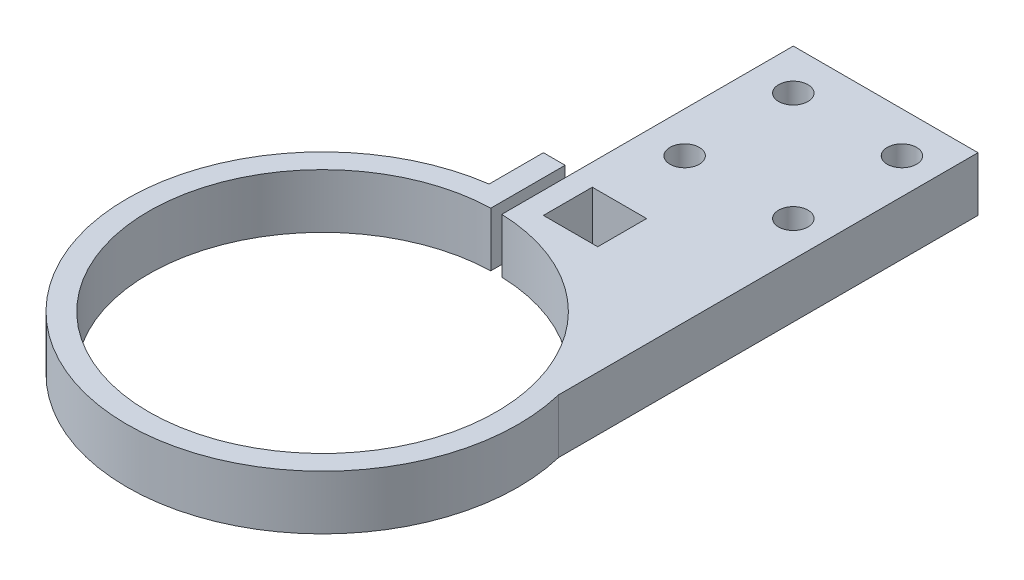
ISO-10303-21;
HEADER;
FILE_DESCRIPTION(('STEP AP214'),'2;1');
FILE_NAME('part.step','',(''),(''),'','','');
FILE_SCHEMA(('AUTOMOTIVE_DESIGN { 1 0 10303 214 1 1 1 1 }'));
ENDSEC;
DATA;
#1=APPLICATION_CONTEXT('core data for automotive mechanical design processes');
#2=APPLICATION_PROTOCOL_DEFINITION('international standard','automotive_design',2000,#1);
#3=PRODUCT_CONTEXT('',#1,'mechanical');
#4=PRODUCT('Part','Part','',(#3));
#5=PRODUCT_RELATED_PRODUCT_CATEGORY('part','',(#4));
#6=PRODUCT_DEFINITION_FORMATION('','',#4);
#7=PRODUCT_DEFINITION_CONTEXT('part definition',#1,'design');
#8=PRODUCT_DEFINITION('design','',#6,#7);
#9=PRODUCT_DEFINITION_SHAPE('','',#8);
#10=(LENGTH_UNIT() NAMED_UNIT(*) SI_UNIT(.MILLI.,.METRE.));
#11=(NAMED_UNIT(*) PLANE_ANGLE_UNIT() SI_UNIT($,.RADIAN.));
#12=(NAMED_UNIT(*) SI_UNIT($,.STERADIAN.) SOLID_ANGLE_UNIT());
#13=UNCERTAINTY_MEASURE_WITH_UNIT(LENGTH_MEASURE(1.E-05),#10,'distance_accuracy_value','');
#14=(GEOMETRIC_REPRESENTATION_CONTEXT(3) GLOBAL_UNCERTAINTY_ASSIGNED_CONTEXT((#13)) GLOBAL_UNIT_ASSIGNED_CONTEXT((#10,
#11,#12)) REPRESENTATION_CONTEXT('',''));
#15=CARTESIAN_POINT('',(0.,0.,0.));
#16=DIRECTION('',(0.,0.,1.));
#17=DIRECTION('',(1.,0.,0.));
#18=AXIS2_PLACEMENT_3D('',#15,#16,#17);
#19=CARTESIAN_POINT('',(0.,12.7,0.));
#20=DIRECTION('',(0.,-1.,0.));
#21=DIRECTION('',(0.,0.,-1.));
#22=AXIS2_PLACEMENT_3D('',#19,#20,#21);
#23=CYLINDRICAL_SURFACE('',#22,45.72);
#24=DIRECTION('',(0.,-1.,0.));
#25=VECTOR('',#24,1.);
#26=CARTESIAN_POINT('',(44.45,12.7,-10.701210211934));
#27=LINE('',#26,#25);
#28=CARTESIAN_POINT('',(44.45,0.,-10.701210211934));
#29=VERTEX_POINT('',#28);
#30=CARTESIAN_POINT('',(44.45,12.7,-10.701210211934));
#31=VERTEX_POINT('',#30);
#32=EDGE_CURVE('E231',#29,#31,#27,.F.);
#33=ORIENTED_EDGE('',*,*,#32,.T.);
#34=CARTESIAN_POINT('',(0.,12.7,0.));
#35=DIRECTION('',(0.,1.,0.));
#36=DIRECTION('',(0.,0.,1.));
#37=AXIS2_PLACEMENT_3D('',#34,#35,#36);
#38=CIRCLE('',#37,45.72);
#39=CARTESIAN_POINT('',(-6.34999999999999,12.7,-45.2768804137388));
#40=VERTEX_POINT('',#39);
#41=EDGE_CURVE('E45',#40,#31,#38,.T.);
#42=ORIENTED_EDGE('',*,*,#41,.F.);
#43=DIRECTION('',(0.,-1.,0.));
#44=VECTOR('',#43,1.);
#45=CARTESIAN_POINT('',(-6.35,12.7,-45.2768804137388));
#46=LINE('',#45,#44);
#47=CARTESIAN_POINT('',(-6.35,0.,-45.2768804137388));
#48=VERTEX_POINT('',#47);
#49=EDGE_CURVE('E322',#40,#48,#46,.T.);
#50=ORIENTED_EDGE('',*,*,#49,.T.);
#51=CARTESIAN_POINT('',(0.,0.,0.));
#52=DIRECTION('',(0.,1.,0.));
#53=DIRECTION('',(0.,0.,1.));
#54=AXIS2_PLACEMENT_3D('',#51,#52,#53);
#55=CIRCLE('',#54,45.72);
#56=EDGE_CURVE('E235',#48,#29,#55,.T.);
#57=ORIENTED_EDGE('',*,*,#56,.T.);
#58=EDGE_LOOP('',(#33,#42,#50,#57));
#59=FACE_BOUND('',#58,.T.);
#60=ADVANCED_FACE('F38',(#59),#23,.T.);
#61=CARTESIAN_POINT('',(0.,12.7,0.));
#62=DIRECTION('',(0.,1.,0.));
#63=DIRECTION('',(0.,0.,1.));
#64=AXIS2_PLACEMENT_3D('',#61,#62,#63);
#65=PLANE('',#64);
#66=DIRECTION('',(1.,0.,0.));
#67=VECTOR('',#66,1.);
#68=CARTESIAN_POINT('',(6.35,12.7,-45.2768804137388));
#69=LINE('',#68,#67);
#70=CARTESIAN_POINT('',(6.35,12.7,-45.2768804137388));
#71=VERTEX_POINT('',#70);
#72=CARTESIAN_POINT('',(19.05,12.7,-45.2768804137388));
#73=VERTEX_POINT('',#72);
#74=EDGE_CURVE('E134',#71,#73,#69,.T.);
#75=ORIENTED_EDGE('',*,*,#74,.F.);
#76=DIRECTION('',(0.,0.,1.));
#77=VECTOR('',#76,1.);
#78=CARTESIAN_POINT('',(6.35,12.7,-56.7068804137388));
#79=LINE('',#78,#77);
#80=CARTESIAN_POINT('',(6.35,12.7,-56.7068804137388));
#81=VERTEX_POINT('',#80);
#82=EDGE_CURVE('E125',#81,#71,#79,.T.);
#83=ORIENTED_EDGE('',*,*,#82,.F.);
#84=DIRECTION('',(-1.,0.,0.));
#85=VECTOR('',#84,1.);
#86=CARTESIAN_POINT('',(6.35,12.7,-56.7068804137388));
#87=LINE('',#86,#85);
#88=CARTESIAN_POINT('',(19.05,12.7,-56.7068804137388));
#89=VERTEX_POINT('',#88);
#90=EDGE_CURVE('E152',#89,#81,#87,.T.);
#91=ORIENTED_EDGE('',*,*,#90,.F.);
#92=DIRECTION('',(0.,0.,-1.));
#93=VECTOR('',#92,1.);
#94=CARTESIAN_POINT('',(19.05,12.7,-56.7068804137388));
#95=LINE('',#94,#93);
#96=EDGE_CURVE('E148',#73,#89,#95,.T.);
#97=ORIENTED_EDGE('',*,*,#96,.F.);
#98=EDGE_LOOP('',(#75,#83,#91,#97));
#99=FACE_BOUND('',#98,.T.);
#100=CARTESIAN_POINT('',(36.195,12.7,-99.2518804137387));
#101=DIRECTION('',(0.,1.,0.));
#102=DIRECTION('',(0.,0.,1.));
#103=AXIS2_PLACEMENT_3D('',#100,#101,#102);
#104=CIRCLE('',#103,3.42900000000001);
#105=CARTESIAN_POINT('',(36.195,12.7,-95.8228804137387));
#106=VERTEX_POINT('',#105);
#107=EDGE_CURVE('E168',#106,#106,#104,.T.);
#108=ORIENTED_EDGE('',*,*,#107,.F.);
#109=EDGE_LOOP('',(#108));
#110=FACE_BOUND('',#109,.T.);
#111=CARTESIAN_POINT('',(36.1950000000003,12.7,-73.8518804137388));
#112=DIRECTION('',(0.,1.,0.));
#113=DIRECTION('',(0.,0.,1.));
#114=AXIS2_PLACEMENT_3D('',#111,#112,#113);
#115=CIRCLE('',#114,3.42900000000001);
#116=CARTESIAN_POINT('',(36.1950000000003,12.7,-70.4228804137388));
#117=VERTEX_POINT('',#116);
#118=EDGE_CURVE('E189',#117,#117,#115,.T.);
#119=ORIENTED_EDGE('',*,*,#118,.F.);
#120=EDGE_LOOP('',(#119));
#121=FACE_BOUND('',#120,.T.);
#122=CARTESIAN_POINT('',(10.7950000000003,12.7,-73.8518804137388));
#123=DIRECTION('',(0.,1.,0.));
#124=DIRECTION('',(0.,0.,1.));
#125=AXIS2_PLACEMENT_3D('',#122,#123,#124);
#126=CIRCLE('',#125,3.42900000000001);
#127=CARTESIAN_POINT('',(10.7950000000003,12.7,-70.4228804137387));
#128=VERTEX_POINT('',#127);
#129=EDGE_CURVE('E196',#128,#128,#126,.T.);
#130=ORIENTED_EDGE('',*,*,#129,.F.);
#131=EDGE_LOOP('',(#130));
#132=FACE_BOUND('',#131,.T.);
#133=CARTESIAN_POINT('',(10.795,12.7,-99.2518804137387));
#134=DIRECTION('',(0.,1.,0.));
#135=DIRECTION('',(0.,0.,1.));
#136=AXIS2_PLACEMENT_3D('',#133,#134,#135);
#137=CIRCLE('',#136,3.42900000000001);
#138=CARTESIAN_POINT('',(10.795,12.7,-95.8228804137387));
#139=VERTEX_POINT('',#138);
#140=EDGE_CURVE('E274',#139,#139,#137,.T.);
#141=ORIENTED_EDGE('',*,*,#140,.F.);
#142=EDGE_LOOP('',(#141));
#143=FACE_BOUND('',#142,.T.);
#144=ORIENTED_EDGE('',*,*,#41,.T.);
#145=DIRECTION('',(0.,0.,1.));
#146=VECTOR('',#145,1.);
#147=CARTESIAN_POINT('',(44.45,12.7,-57.9768804137388));
#148=LINE('',#147,#146);
#149=CARTESIAN_POINT('',(44.45,12.7,-108.776880413739));
#150=VERTEX_POINT('',#149);
#151=EDGE_CURVE('E239',#150,#31,#148,.T.);
#152=ORIENTED_EDGE('',*,*,#151,.F.);
#153=DIRECTION('',(-1.,0.,0.));
#154=VECTOR('',#153,1.);
#155=CARTESIAN_POINT('',(44.45,12.7,-108.776880413739));
#156=LINE('',#155,#154);
#157=CARTESIAN_POINT('',(1.27,12.7,-108.776880413739));
#158=VERTEX_POINT('',#157);
#159=EDGE_CURVE('E269',#150,#158,#156,.T.);
#160=ORIENTED_EDGE('',*,*,#159,.T.);
#161=DIRECTION('',(0.,0.,-1.));
#162=VECTOR('',#161,1.);
#163=CARTESIAN_POINT('',(1.27,12.7,-39.7899336263232));
#164=LINE('',#163,#162);
#165=CARTESIAN_POINT('',(1.27,12.7,-40.6201514029675));
#166=VERTEX_POINT('',#165);
#167=EDGE_CURVE('E292',#166,#158,#164,.T.);
#168=ORIENTED_EDGE('',*,*,#167,.F.);
#169=CARTESIAN_POINT('',(0.,12.7,0.));
#170=DIRECTION('',(0.,1.,0.));
#171=DIRECTION('',(0.,0.,1.));
#172=AXIS2_PLACEMENT_3D('',#169,#170,#171);
#173=CIRCLE('',#172,40.64);
#174=CARTESIAN_POINT('',(-1.27,12.7,-40.6201514029675));
#175=VERTEX_POINT('',#174);
#176=EDGE_CURVE('E323',#175,#166,#173,.T.);
#177=ORIENTED_EDGE('',*,*,#176,.F.);
#178=DIRECTION('',(0.,0.,1.));
#179=VECTOR('',#178,1.);
#180=CARTESIAN_POINT('',(-1.27,12.7,-39.7899336263232));
#181=LINE('',#180,#179);
#182=CARTESIAN_POINT('',(-1.27,12.7,-57.9768804137387));
#183=VERTEX_POINT('',#182);
#184=EDGE_CURVE('E297',#183,#175,#181,.T.);
#185=ORIENTED_EDGE('',*,*,#184,.F.);
#186=DIRECTION('',(-1.,0.,0.));
#187=VECTOR('',#186,1.);
#188=CARTESIAN_POINT('',(6.35,12.7,-57.9768804137387));
#189=LINE('',#188,#187);
#190=CARTESIAN_POINT('',(-6.35,12.7,-57.9768804137387));
#191=VERTEX_POINT('',#190);
#192=EDGE_CURVE('E308',#183,#191,#189,.T.);
#193=ORIENTED_EDGE('',*,*,#192,.T.);
#194=DIRECTION('',(0.,0.,1.));
#195=VECTOR('',#194,1.);
#196=CARTESIAN_POINT('',(-6.35,12.7,-57.9768804137387));
#197=LINE('',#196,#195);
#198=EDGE_CURVE('E246',#191,#40,#197,.T.);
#199=ORIENTED_EDGE('',*,*,#198,.T.);
#200=EDGE_LOOP('',(#144,#152,#160,#168,#177,#185,#193,#199));
#201=FACE_BOUND('',#200,.T.);
#202=ADVANCED_FACE('F146',(#99,#110,#121,#132,#143,#201),#65,.T.);
#203=CARTESIAN_POINT('',(0.,0.,0.));
#204=DIRECTION('',(0.,1.,0.));
#205=DIRECTION('',(0.,0.,1.));
#206=AXIS2_PLACEMENT_3D('',#203,#204,#205);
#207=PLANE('',#206);
#208=DIRECTION('',(0.,0.,1.));
#209=VECTOR('',#208,1.);
#210=CARTESIAN_POINT('',(6.35,0.,-56.7068804137388));
#211=LINE('',#210,#209);
#212=CARTESIAN_POINT('',(6.35,0.,-56.7068804137388));
#213=VERTEX_POINT('',#212);
#214=CARTESIAN_POINT('',(6.35,0.,-45.2768804137388));
#215=VERTEX_POINT('',#214);
#216=EDGE_CURVE('E60',#213,#215,#211,.T.);
#217=ORIENTED_EDGE('',*,*,#216,.T.);
#218=DIRECTION('',(1.,0.,0.));
#219=VECTOR('',#218,1.);
#220=CARTESIAN_POINT('',(6.35,0.,-45.2768804137388));
#221=LINE('',#220,#219);
#222=CARTESIAN_POINT('',(19.05,0.,-45.2768804137388));
#223=VERTEX_POINT('',#222);
#224=EDGE_CURVE('E141',#215,#223,#221,.T.);
#225=ORIENTED_EDGE('',*,*,#224,.T.);
#226=DIRECTION('',(0.,0.,-1.));
#227=VECTOR('',#226,1.);
#228=CARTESIAN_POINT('',(19.05,0.,-56.7068804137388));
#229=LINE('',#228,#227);
#230=CARTESIAN_POINT('',(19.05,0.,-56.7068804137388));
#231=VERTEX_POINT('',#230);
#232=EDGE_CURVE('E170',#223,#231,#229,.T.);
#233=ORIENTED_EDGE('',*,*,#232,.T.);
#234=DIRECTION('',(-1.,0.,0.));
#235=VECTOR('',#234,1.);
#236=CARTESIAN_POINT('',(6.35,0.,-56.7068804137388));
#237=LINE('',#236,#235);
#238=EDGE_CURVE('E135',#231,#213,#237,.T.);
#239=ORIENTED_EDGE('',*,*,#238,.T.);
#240=EDGE_LOOP('',(#217,#225,#233,#239));
#241=FACE_BOUND('',#240,.T.);
#242=CARTESIAN_POINT('',(36.195,0.,-99.2518804137387));
#243=DIRECTION('',(0.,1.,0.));
#244=DIRECTION('',(0.,0.,1.));
#245=AXIS2_PLACEMENT_3D('',#242,#243,#244);
#246=CIRCLE('',#245,3.42900000000001);
#247=CARTESIAN_POINT('',(36.195,0.,-95.8228804137387));
#248=VERTEX_POINT('',#247);
#249=EDGE_CURVE('E182',#248,#248,#246,.T.);
#250=ORIENTED_EDGE('',*,*,#249,.T.);
#251=EDGE_LOOP('',(#250));
#252=FACE_BOUND('',#251,.T.);
#253=CARTESIAN_POINT('',(36.1950000000003,0.,-73.8518804137388));
#254=DIRECTION('',(0.,1.,0.));
#255=DIRECTION('',(0.,0.,1.));
#256=AXIS2_PLACEMENT_3D('',#253,#254,#255);
#257=CIRCLE('',#256,3.42900000000001);
#258=CARTESIAN_POINT('',(36.1950000000003,0.,-70.4228804137388));
#259=VERTEX_POINT('',#258);
#260=EDGE_CURVE('E194',#259,#259,#257,.T.);
#261=ORIENTED_EDGE('',*,*,#260,.T.);
#262=EDGE_LOOP('',(#261));
#263=FACE_BOUND('',#262,.T.);
#264=CARTESIAN_POINT('',(10.7950000000003,0.,-73.8518804137388));
#265=DIRECTION('',(0.,1.,0.));
#266=DIRECTION('',(0.,0.,1.));
#267=AXIS2_PLACEMENT_3D('',#264,#265,#266);
#268=CIRCLE('',#267,3.42900000000001);
#269=CARTESIAN_POINT('',(10.7950000000003,0.,-70.4228804137387));
#270=VERTEX_POINT('',#269);
#271=EDGE_CURVE('E200',#270,#270,#268,.T.);
#272=ORIENTED_EDGE('',*,*,#271,.T.);
#273=EDGE_LOOP('',(#272));
#274=FACE_BOUND('',#273,.T.);
#275=CARTESIAN_POINT('',(10.795,0.,-99.2518804137387));
#276=DIRECTION('',(0.,1.,0.));
#277=DIRECTION('',(0.,0.,1.));
#278=AXIS2_PLACEMENT_3D('',#275,#276,#277);
#279=CIRCLE('',#278,3.42900000000001);
#280=CARTESIAN_POINT('',(10.795,0.,-95.8228804137387));
#281=VERTEX_POINT('',#280);
#282=EDGE_CURVE('E142',#281,#281,#279,.T.);
#283=ORIENTED_EDGE('',*,*,#282,.T.);
#284=EDGE_LOOP('',(#283));
#285=FACE_BOUND('',#284,.T.);
#286=DIRECTION('',(0.,0.,-1.));
#287=VECTOR('',#286,1.);
#288=CARTESIAN_POINT('',(1.27,0.,-39.7899336263232));
#289=LINE('',#288,#287);
#290=CARTESIAN_POINT('',(1.27,0.,-40.6201514029675));
#291=VERTEX_POINT('',#290);
#292=CARTESIAN_POINT('',(1.27,0.,-108.776880413739));
#293=VERTEX_POINT('',#292);
#294=EDGE_CURVE('E258',#291,#293,#289,.T.);
#295=ORIENTED_EDGE('',*,*,#294,.T.);
#296=DIRECTION('',(-1.,0.,0.));
#297=VECTOR('',#296,1.);
#298=CARTESIAN_POINT('',(44.45,0.,-108.776880413739));
#299=LINE('',#298,#297);
#300=CARTESIAN_POINT('',(44.45,0.,-108.776880413739));
#301=VERTEX_POINT('',#300);
#302=EDGE_CURVE('E273',#301,#293,#299,.T.);
#303=ORIENTED_EDGE('',*,*,#302,.F.);
#304=DIRECTION('',(0.,0.,-1.));
#305=VECTOR('',#304,1.);
#306=CARTESIAN_POINT('',(44.45,0.,-57.9768804137388));
#307=LINE('',#306,#305);
#308=EDGE_CURVE('E255',#29,#301,#307,.T.);
#309=ORIENTED_EDGE('',*,*,#308,.F.);
#310=ORIENTED_EDGE('',*,*,#56,.F.);
#311=DIRECTION('',(0.,0.,1.));
#312=VECTOR('',#311,1.);
#313=CARTESIAN_POINT('',(-6.35,0.,-57.9768804137387));
#314=LINE('',#313,#312);
#315=CARTESIAN_POINT('',(-6.35,0.,-57.9768804137387));
#316=VERTEX_POINT('',#315);
#317=EDGE_CURVE('E315',#316,#48,#314,.T.);
#318=ORIENTED_EDGE('',*,*,#317,.F.);
#319=DIRECTION('',(-1.,0.,0.));
#320=VECTOR('',#319,1.);
#321=CARTESIAN_POINT('',(6.35,0.,-57.9768804137387));
#322=LINE('',#321,#320);
#323=CARTESIAN_POINT('',(-1.27,0.,-57.9768804137387));
#324=VERTEX_POINT('',#323);
#325=EDGE_CURVE('E318',#324,#316,#322,.T.);
#326=ORIENTED_EDGE('',*,*,#325,.F.);
#327=DIRECTION('',(0.,0.,1.));
#328=VECTOR('',#327,1.);
#329=CARTESIAN_POINT('',(-1.27,0.,-39.7899336263232));
#330=LINE('',#329,#328);
#331=CARTESIAN_POINT('',(-1.27,0.,-40.6201514029675));
#332=VERTEX_POINT('',#331);
#333=EDGE_CURVE('E288',#324,#332,#330,.T.);
#334=ORIENTED_EDGE('',*,*,#333,.T.);
#335=CARTESIAN_POINT('',(0.,0.,0.));
#336=DIRECTION('',(0.,1.,0.));
#337=DIRECTION('',(0.,0.,1.));
#338=AXIS2_PLACEMENT_3D('',#335,#336,#337);
#339=CIRCLE('',#338,40.64);
#340=EDGE_CURVE('E285',#332,#291,#339,.T.);
#341=ORIENTED_EDGE('',*,*,#340,.T.);
#342=EDGE_LOOP('',(#295,#303,#309,#310,#318,#326,#334,#341));
#343=FACE_BOUND('',#342,.T.);
#344=ADVANCED_FACE('F204',(#241,#252,#263,#274,#285,#343),#207,.F.);
#345=CARTESIAN_POINT('',(0.,12.7,0.));
#346=DIRECTION('',(0.,-1.,0.));
#347=DIRECTION('',(0.,0.,-1.));
#348=AXIS2_PLACEMENT_3D('',#345,#346,#347);
#349=CYLINDRICAL_SURFACE('',#348,40.64);
#350=ORIENTED_EDGE('',*,*,#176,.T.);
#351=DIRECTION('',(0.,-1.,0.));
#352=VECTOR('',#351,1.);
#353=CARTESIAN_POINT('',(1.27,12.7,-40.6201514029675));
#354=LINE('',#353,#352);
#355=EDGE_CURVE('E293',#166,#291,#354,.T.);
#356=ORIENTED_EDGE('',*,*,#355,.T.);
#357=ORIENTED_EDGE('',*,*,#340,.F.);
#358=DIRECTION('',(0.,-1.,0.));
#359=VECTOR('',#358,1.);
#360=CARTESIAN_POINT('',(-1.27,12.7,-40.6201514029675));
#361=LINE('',#360,#359);
#362=EDGE_CURVE('E300',#332,#175,#361,.F.);
#363=ORIENTED_EDGE('',*,*,#362,.T.);
#364=EDGE_LOOP('',(#350,#356,#357,#363));
#365=FACE_BOUND('',#364,.T.);
#366=ADVANCED_FACE('F329',(#365),#349,.F.);
#367=CARTESIAN_POINT('',(6.35,12.7,-57.9768804137387));
#368=DIRECTION('',(0.,0.,1.));
#369=DIRECTION('',(1.,0.,0.));
#370=AXIS2_PLACEMENT_3D('',#367,#368,#369);
#371=PLANE('',#370);
#372=DIRECTION('',(0.,1.,0.));
#373=VECTOR('',#372,1.);
#374=CARTESIAN_POINT('',(-1.27,12.7,-57.9768804137387));
#375=LINE('',#374,#373);
#376=EDGE_CURVE('E12',#324,#183,#375,.T.);
#377=ORIENTED_EDGE('',*,*,#376,.F.);
#378=ORIENTED_EDGE('',*,*,#325,.T.);
#379=DIRECTION('',(0.,-1.,0.));
#380=VECTOR('',#379,1.);
#381=CARTESIAN_POINT('',(-6.35,12.7,-57.9768804137387));
#382=LINE('',#381,#380);
#383=EDGE_CURVE('E312',#191,#316,#382,.T.);
#384=ORIENTED_EDGE('',*,*,#383,.F.);
#385=ORIENTED_EDGE('',*,*,#192,.F.);
#386=EDGE_LOOP('',(#377,#378,#384,#385));
#387=FACE_BOUND('',#386,.T.);
#388=ADVANCED_FACE('F336',(#387),#371,.F.);
#389=CARTESIAN_POINT('',(-6.35,12.7,-57.9768804137387));
#390=DIRECTION('',(1.,0.,0.));
#391=DIRECTION('',(0.,0.,-1.));
#392=AXIS2_PLACEMENT_3D('',#389,#390,#391);
#393=PLANE('',#392);
#394=ORIENTED_EDGE('',*,*,#317,.T.);
#395=ORIENTED_EDGE('',*,*,#49,.F.);
#396=ORIENTED_EDGE('',*,*,#198,.F.);
#397=ORIENTED_EDGE('',*,*,#383,.T.);
#398=EDGE_LOOP('',(#394,#395,#396,#397));
#399=FACE_BOUND('',#398,.T.);
#400=ADVANCED_FACE('F340',(#399),#393,.F.);
#401=CARTESIAN_POINT('',(-1.27,12.7,-39.7899336263232));
#402=DIRECTION('',(1.,0.,0.));
#403=DIRECTION('',(0.,0.,-1.));
#404=AXIS2_PLACEMENT_3D('',#401,#402,#403);
#405=PLANE('',#404);
#406=ORIENTED_EDGE('',*,*,#333,.F.);
#407=ORIENTED_EDGE('',*,*,#376,.T.);
#408=ORIENTED_EDGE('',*,*,#184,.T.);
#409=ORIENTED_EDGE('',*,*,#362,.F.);
#410=EDGE_LOOP('',(#406,#407,#408,#409));
#411=FACE_BOUND('',#410,.T.);
#412=ADVANCED_FACE('F342',(#411),#405,.T.);
#413=CARTESIAN_POINT('',(1.27,12.7,-39.7899336263232));
#414=DIRECTION('',(-1.,0.,0.));
#415=DIRECTION('',(0.,0.,1.));
#416=AXIS2_PLACEMENT_3D('',#413,#414,#415);
#417=PLANE('',#416);
#418=ORIENTED_EDGE('',*,*,#167,.T.);
#419=DIRECTION('',(0.,1.,0.));
#420=VECTOR('',#419,1.);
#421=CARTESIAN_POINT('',(1.27,0.,-108.776880413739));
#422=LINE('',#421,#420);
#423=EDGE_CURVE('E240',#293,#158,#422,.T.);
#424=ORIENTED_EDGE('',*,*,#423,.F.);
#425=ORIENTED_EDGE('',*,*,#294,.F.);
#426=ORIENTED_EDGE('',*,*,#355,.F.);
#427=EDGE_LOOP('',(#418,#424,#425,#426));
#428=FACE_BOUND('',#427,.T.);
#429=ADVANCED_FACE('F290',(#428),#417,.T.);
#430=CARTESIAN_POINT('',(44.45,0.,0.));
#431=DIRECTION('',(-1.,0.,0.));
#432=DIRECTION('',(0.,0.,1.));
#433=AXIS2_PLACEMENT_3D('',#430,#431,#432);
#434=PLANE('',#433);
#435=ORIENTED_EDGE('',*,*,#32,.F.);
#436=ORIENTED_EDGE('',*,*,#308,.T.);
#437=DIRECTION('',(0.,1.,0.));
#438=VECTOR('',#437,1.);
#439=CARTESIAN_POINT('',(44.45,0.,-108.776880413739));
#440=LINE('',#439,#438);
#441=EDGE_CURVE('E252',#301,#150,#440,.T.);
#442=ORIENTED_EDGE('',*,*,#441,.T.);
#443=ORIENTED_EDGE('',*,*,#151,.T.);
#444=EDGE_LOOP('',(#435,#436,#442,#443));
#445=FACE_BOUND('',#444,.T.);
#446=ADVANCED_FACE('F250',(#445),#434,.F.);
#447=CARTESIAN_POINT('',(44.45,0.,-108.776880413739));
#448=DIRECTION('',(0.,0.,-1.));
#449=DIRECTION('',(-1.,0.,0.));
#450=AXIS2_PLACEMENT_3D('',#447,#448,#449);
#451=PLANE('',#450);
#452=ORIENTED_EDGE('',*,*,#159,.F.);
#453=ORIENTED_EDGE('',*,*,#441,.F.);
#454=ORIENTED_EDGE('',*,*,#302,.T.);
#455=ORIENTED_EDGE('',*,*,#423,.T.);
#456=EDGE_LOOP('',(#452,#453,#454,#455));
#457=FACE_BOUND('',#456,.T.);
#458=ADVANCED_FACE('F220',(#457),#451,.T.);
#459=CARTESIAN_POINT('',(10.795,12.7,-99.2518804137387));
#460=DIRECTION('',(0.,-1.,0.));
#461=DIRECTION('',(0.,0.,-1.));
#462=AXIS2_PLACEMENT_3D('',#459,#460,#461);
#463=CYLINDRICAL_SURFACE('',#462,3.42900000000001);
#464=ORIENTED_EDGE('',*,*,#140,.T.);
#465=EDGE_LOOP('',(#464));
#466=FACE_BOUND('',#465,.T.);
#467=ORIENTED_EDGE('',*,*,#282,.F.);
#468=EDGE_LOOP('',(#467));
#469=FACE_BOUND('',#468,.T.);
#470=ADVANCED_FACE('F210',(#466,#469),#463,.F.);
#471=CARTESIAN_POINT('',(10.7950000000003,12.7,-73.8518804137388));
#472=DIRECTION('',(0.,-1.,0.));
#473=DIRECTION('',(0.,0.,-1.));
#474=AXIS2_PLACEMENT_3D('',#471,#472,#473);
#475=CYLINDRICAL_SURFACE('',#474,3.42900000000001);
#476=ORIENTED_EDGE('',*,*,#129,.T.);
#477=EDGE_LOOP('',(#476));
#478=FACE_BOUND('',#477,.T.);
#479=ORIENTED_EDGE('',*,*,#271,.F.);
#480=EDGE_LOOP('',(#479));
#481=FACE_BOUND('',#480,.T.);
#482=ADVANCED_FACE('F207',(#478,#481),#475,.F.);
#483=CARTESIAN_POINT('',(36.1950000000003,12.7,-73.8518804137388));
#484=DIRECTION('',(0.,-1.,0.));
#485=DIRECTION('',(0.,0.,-1.));
#486=AXIS2_PLACEMENT_3D('',#483,#484,#485);
#487=CYLINDRICAL_SURFACE('',#486,3.42900000000001);
#488=ORIENTED_EDGE('',*,*,#118,.T.);
#489=EDGE_LOOP('',(#488));
#490=FACE_BOUND('',#489,.T.);
#491=ORIENTED_EDGE('',*,*,#260,.F.);
#492=EDGE_LOOP('',(#491));
#493=FACE_BOUND('',#492,.T.);
#494=ADVANCED_FACE('F209',(#490,#493),#487,.F.);
#495=CARTESIAN_POINT('',(36.195,12.7,-99.2518804137387));
#496=DIRECTION('',(0.,-1.,0.));
#497=DIRECTION('',(0.,0.,-1.));
#498=AXIS2_PLACEMENT_3D('',#495,#496,#497);
#499=CYLINDRICAL_SURFACE('',#498,3.42900000000001);
#500=ORIENTED_EDGE('',*,*,#107,.T.);
#501=EDGE_LOOP('',(#500));
#502=FACE_BOUND('',#501,.T.);
#503=ORIENTED_EDGE('',*,*,#249,.F.);
#504=EDGE_LOOP('',(#503));
#505=FACE_BOUND('',#504,.T.);
#506=ADVANCED_FACE('F217',(#502,#505),#499,.F.);
#507=CARTESIAN_POINT('',(6.35,12.7,-56.7068804137388));
#508=DIRECTION('',(1.,0.,0.));
#509=DIRECTION('',(0.,0.,-1.));
#510=AXIS2_PLACEMENT_3D('',#507,#508,#509);
#511=PLANE('',#510);
#512=ORIENTED_EDGE('',*,*,#216,.F.);
#513=DIRECTION('',(0.,-1.,0.));
#514=VECTOR('',#513,1.);
#515=CARTESIAN_POINT('',(6.35,12.7,-56.7068804137388));
#516=LINE('',#515,#514);
#517=EDGE_CURVE('E129',#81,#213,#516,.T.);
#518=ORIENTED_EDGE('',*,*,#517,.F.);
#519=ORIENTED_EDGE('',*,*,#82,.T.);
#520=DIRECTION('',(0.,-1.,0.));
#521=VECTOR('',#520,1.);
#522=CARTESIAN_POINT('',(6.35,12.7,-45.2768804137388));
#523=LINE('',#522,#521);
#524=EDGE_CURVE('E128',#71,#215,#523,.T.);
#525=ORIENTED_EDGE('',*,*,#524,.T.);
#526=EDGE_LOOP('',(#512,#518,#519,#525));
#527=FACE_BOUND('',#526,.T.);
#528=ADVANCED_FACE('F127',(#527),#511,.T.);
#529=CARTESIAN_POINT('',(6.35,12.7,-45.2768804137388));
#530=DIRECTION('',(0.,0.,-1.));
#531=DIRECTION('',(-1.,0.,0.));
#532=AXIS2_PLACEMENT_3D('',#529,#530,#531);
#533=PLANE('',#532);
#534=ORIENTED_EDGE('',*,*,#224,.F.);
#535=ORIENTED_EDGE('',*,*,#524,.F.);
#536=ORIENTED_EDGE('',*,*,#74,.T.);
#537=DIRECTION('',(0.,-1.,0.));
#538=VECTOR('',#537,1.);
#539=CARTESIAN_POINT('',(19.05,12.7,-45.2768804137388));
#540=LINE('',#539,#538);
#541=EDGE_CURVE('E143',#73,#223,#540,.T.);
#542=ORIENTED_EDGE('',*,*,#541,.T.);
#543=EDGE_LOOP('',(#534,#535,#536,#542));
#544=FACE_BOUND('',#543,.T.);
#545=ADVANCED_FACE('F138',(#544),#533,.T.);
#546=CARTESIAN_POINT('',(19.05,12.7,-56.7068804137388));
#547=DIRECTION('',(-1.,0.,0.));
#548=DIRECTION('',(0.,0.,1.));
#549=AXIS2_PLACEMENT_3D('',#546,#547,#548);
#550=PLANE('',#549);
#551=ORIENTED_EDGE('',*,*,#232,.F.);
#552=ORIENTED_EDGE('',*,*,#541,.F.);
#553=ORIENTED_EDGE('',*,*,#96,.T.);
#554=DIRECTION('',(0.,-1.,0.));
#555=VECTOR('',#554,1.);
#556=CARTESIAN_POINT('',(19.05,12.7,-56.7068804137388));
#557=LINE('',#556,#555);
#558=EDGE_CURVE('E52',#89,#231,#557,.T.);
#559=ORIENTED_EDGE('',*,*,#558,.T.);
#560=EDGE_LOOP('',(#551,#552,#553,#559));
#561=FACE_BOUND('',#560,.T.);
#562=ADVANCED_FACE('F480',(#561),#550,.T.);
#563=CARTESIAN_POINT('',(6.35,12.7,-56.7068804137388));
#564=DIRECTION('',(0.,0.,1.));
#565=DIRECTION('',(1.,0.,0.));
#566=AXIS2_PLACEMENT_3D('',#563,#564,#565);
#567=PLANE('',#566);
#568=ORIENTED_EDGE('',*,*,#238,.F.);
#569=ORIENTED_EDGE('',*,*,#558,.F.);
#570=ORIENTED_EDGE('',*,*,#90,.T.);
#571=ORIENTED_EDGE('',*,*,#517,.T.);
#572=EDGE_LOOP('',(#568,#569,#570,#571));
#573=FACE_BOUND('',#572,.T.);
#574=ADVANCED_FACE('F488',(#573),#567,.T.);
#575=CLOSED_SHELL('',(#60,#202,#344,#366,#388,#400,#412,#429,#446,#458,#470,#482,#494,#506,#528,
#545,#562,#574));
#576=MANIFOLD_SOLID_BREP('B2',#575);
#577=ADVANCED_BREP_SHAPE_REPRESENTATION('',(#18,#576),#14);
#578=SHAPE_DEFINITION_REPRESENTATION(#9,#577);
ENDSEC;
END-ISO-10303-21;
